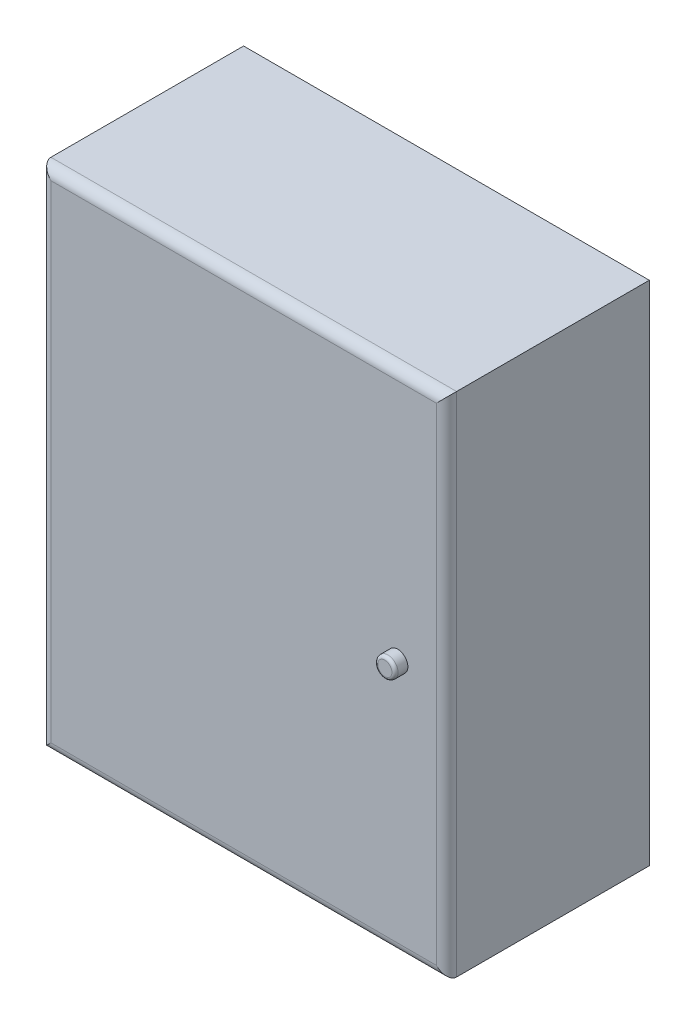
ISO-10303-21;
HEADER;
FILE_DESCRIPTION(('STEP AP214'),'2;1');
FILE_NAME('part.step','',(''),(''),'','','');
FILE_SCHEMA(('AUTOMOTIVE_DESIGN { 1 0 10303 214 1 1 1 1 }'));
ENDSEC;
DATA;
#1=APPLICATION_CONTEXT('core data for automotive mechanical design processes');
#2=APPLICATION_PROTOCOL_DEFINITION('international standard','automotive_design',2000,#1);
#3=PRODUCT_CONTEXT('',#1,'mechanical');
#4=PRODUCT('Part','Part','',(#3));
#5=PRODUCT_RELATED_PRODUCT_CATEGORY('part','',(#4));
#6=PRODUCT_DEFINITION_FORMATION('','',#4);
#7=PRODUCT_DEFINITION_CONTEXT('part definition',#1,'design');
#8=PRODUCT_DEFINITION('design','',#6,#7);
#9=PRODUCT_DEFINITION_SHAPE('','',#8);
#10=(LENGTH_UNIT() NAMED_UNIT(*) SI_UNIT(.MILLI.,.METRE.));
#11=(NAMED_UNIT(*) PLANE_ANGLE_UNIT() SI_UNIT($,.RADIAN.));
#12=(NAMED_UNIT(*) SI_UNIT($,.STERADIAN.) SOLID_ANGLE_UNIT());
#13=UNCERTAINTY_MEASURE_WITH_UNIT(LENGTH_MEASURE(1.E-05),#10,'distance_accuracy_value','');
#14=(GEOMETRIC_REPRESENTATION_CONTEXT(3) GLOBAL_UNCERTAINTY_ASSIGNED_CONTEXT((#13)) GLOBAL_UNIT_ASSIGNED_CONTEXT((#10,
#11,#12)) REPRESENTATION_CONTEXT('',''));
#15=CARTESIAN_POINT('',(0.,0.,0.));
#16=DIRECTION('',(0.,0.,1.));
#17=DIRECTION('',(1.,0.,0.));
#18=AXIS2_PLACEMENT_3D('',#15,#16,#17);
#19=CARTESIAN_POINT('',(0.,0.,200.));
#20=DIRECTION('',(1.,0.,0.));
#21=DIRECTION('',(0.,0.,-1.));
#22=AXIS2_PLACEMENT_3D('',#19,#20,#21);
#23=PLANE('',#22);
#24=DIRECTION('',(0.,0.,-1.));
#25=VECTOR('',#24,1.);
#26=CARTESIAN_POINT('',(0.,0.,200.));
#27=LINE('',#26,#25);
#28=CARTESIAN_POINT('',(0.,0.,190.));
#29=VERTEX_POINT('',#28);
#30=CARTESIAN_POINT('',(0.,0.,0.));
#31=VERTEX_POINT('',#30);
#32=EDGE_CURVE('E84',#29,#31,#27,.T.);
#33=ORIENTED_EDGE('',*,*,#32,.F.);
#34=DIRECTION('',(0.,-1.,0.));
#35=VECTOR('',#34,1.);
#36=CARTESIAN_POINT('',(0.,0.,190.));
#37=LINE('',#36,#35);
#38=CARTESIAN_POINT('',(0.,500.,190.));
#39=VERTEX_POINT('',#38);
#40=EDGE_CURVE('E47',#29,#39,#37,.F.);
#41=ORIENTED_EDGE('',*,*,#40,.T.);
#42=DIRECTION('',(0.,0.,-1.));
#43=VECTOR('',#42,1.);
#44=CARTESIAN_POINT('',(0.,500.,200.));
#45=LINE('',#44,#43);
#46=CARTESIAN_POINT('',(0.,500.,0.));
#47=VERTEX_POINT('',#46);
#48=EDGE_CURVE('E101',#39,#47,#45,.T.);
#49=ORIENTED_EDGE('',*,*,#48,.T.);
#50=DIRECTION('',(0.,-1.,0.));
#51=VECTOR('',#50,1.);
#52=CARTESIAN_POINT('',(0.,0.,0.));
#53=LINE('',#52,#51);
#54=EDGE_CURVE('E97',#47,#31,#53,.T.);
#55=ORIENTED_EDGE('',*,*,#54,.T.);
#56=EDGE_LOOP('',(#33,#41,#49,#55));
#57=FACE_BOUND('',#56,.T.);
#58=ADVANCED_FACE('F32',(#57),#23,.F.);
#59=CARTESIAN_POINT('',(0.,0.,200.));
#60=DIRECTION('',(0.,1.,0.));
#61=DIRECTION('',(0.,0.,1.));
#62=AXIS2_PLACEMENT_3D('',#59,#60,#61);
#63=PLANE('',#62);
#64=DIRECTION('',(0.,0.,-1.));
#65=VECTOR('',#64,1.);
#66=CARTESIAN_POINT('',(400.,0.,200.));
#67=LINE('',#66,#65);
#68=CARTESIAN_POINT('',(400.,0.,190.));
#69=VERTEX_POINT('',#68);
#70=CARTESIAN_POINT('',(400.,0.,0.));
#71=VERTEX_POINT('',#70);
#72=EDGE_CURVE('E91',#69,#71,#67,.T.);
#73=ORIENTED_EDGE('',*,*,#72,.F.);
#74=DIRECTION('',(1.,0.,0.));
#75=VECTOR('',#74,1.);
#76=CARTESIAN_POINT('',(0.,0.,190.));
#77=LINE('',#76,#75);
#78=EDGE_CURVE('E55',#69,#29,#77,.F.);
#79=ORIENTED_EDGE('',*,*,#78,.T.);
#80=ORIENTED_EDGE('',*,*,#32,.T.);
#81=DIRECTION('',(1.,0.,0.));
#82=VECTOR('',#81,1.);
#83=CARTESIAN_POINT('',(0.,0.,0.));
#84=LINE('',#83,#82);
#85=EDGE_CURVE('E87',#31,#71,#84,.T.);
#86=ORIENTED_EDGE('',*,*,#85,.T.);
#87=EDGE_LOOP('',(#73,#79,#80,#86));
#88=FACE_BOUND('',#87,.T.);
#89=ADVANCED_FACE('F86',(#88),#63,.F.);
#90=CARTESIAN_POINT('',(400.,0.,200.));
#91=DIRECTION('',(-1.,0.,0.));
#92=DIRECTION('',(0.,0.,1.));
#93=AXIS2_PLACEMENT_3D('',#90,#91,#92);
#94=PLANE('',#93);
#95=DIRECTION('',(0.,0.,-1.));
#96=VECTOR('',#95,1.);
#97=CARTESIAN_POINT('',(400.,500.,200.));
#98=LINE('',#97,#96);
#99=CARTESIAN_POINT('',(400.,500.,190.));
#100=VERTEX_POINT('',#99);
#101=CARTESIAN_POINT('',(400.,500.,0.));
#102=VERTEX_POINT('',#101);
#103=EDGE_CURVE('E113',#100,#102,#98,.T.);
#104=ORIENTED_EDGE('',*,*,#103,.F.);
#105=DIRECTION('',(0.,1.,0.));
#106=VECTOR('',#105,1.);
#107=CARTESIAN_POINT('',(400.,0.,190.));
#108=LINE('',#107,#106);
#109=EDGE_CURVE('E124',#100,#69,#108,.F.);
#110=ORIENTED_EDGE('',*,*,#109,.T.);
#111=ORIENTED_EDGE('',*,*,#72,.T.);
#112=DIRECTION('',(0.,1.,0.));
#113=VECTOR('',#112,1.);
#114=CARTESIAN_POINT('',(400.,0.,0.));
#115=LINE('',#114,#113);
#116=EDGE_CURVE('E99',#71,#102,#115,.T.);
#117=ORIENTED_EDGE('',*,*,#116,.T.);
#118=EDGE_LOOP('',(#104,#110,#111,#117));
#119=FACE_BOUND('',#118,.T.);
#120=ADVANCED_FACE('F157',(#119),#94,.F.);
#121=CARTESIAN_POINT('',(0.,500.,200.));
#122=DIRECTION('',(0.,-1.,0.));
#123=DIRECTION('',(0.,0.,-1.));
#124=AXIS2_PLACEMENT_3D('',#121,#122,#123);
#125=PLANE('',#124);
#126=ORIENTED_EDGE('',*,*,#48,.F.);
#127=DIRECTION('',(-1.,0.,0.));
#128=VECTOR('',#127,1.);
#129=CARTESIAN_POINT('',(0.,500.,190.));
#130=LINE('',#129,#128);
#131=EDGE_CURVE('E129',#39,#100,#130,.F.);
#132=ORIENTED_EDGE('',*,*,#131,.T.);
#133=ORIENTED_EDGE('',*,*,#103,.T.);
#134=DIRECTION('',(-1.,0.,0.));
#135=VECTOR('',#134,1.);
#136=CARTESIAN_POINT('',(0.,500.,0.));
#137=LINE('',#136,#135);
#138=EDGE_CURVE('E110',#102,#47,#137,.T.);
#139=ORIENTED_EDGE('',*,*,#138,.T.);
#140=EDGE_LOOP('',(#126,#132,#133,#139));
#141=FACE_BOUND('',#140,.T.);
#142=ADVANCED_FACE('F188',(#141),#125,.F.);
#143=CARTESIAN_POINT('',(0.,0.,200.));
#144=DIRECTION('',(0.,0.,-1.));
#145=DIRECTION('',(-1.,0.,0.));
#146=AXIS2_PLACEMENT_3D('',#143,#144,#145);
#147=PLANE('',#146);
#148=CARTESIAN_POINT('',(351.956210026515,250.916140828735,200.));
#149=DIRECTION('',(0.,0.,-1.));
#150=DIRECTION('',(-1.,0.,0.));
#151=AXIS2_PLACEMENT_3D('',#148,#149,#150);
#152=CIRCLE('',#151,9.99999999999998);
#153=CARTESIAN_POINT('',(341.956210026515,250.916140828735,200.));
#154=VERTEX_POINT('',#153);
#155=EDGE_CURVE('E131',#154,#154,#152,.F.);
#156=ORIENTED_EDGE('',*,*,#155,.F.);
#157=EDGE_LOOP('',(#156));
#158=FACE_BOUND('',#157,.T.);
#159=DIRECTION('',(1.,0.,0.));
#160=VECTOR('',#159,1.);
#161=CARTESIAN_POINT('',(0.,10.,200.));
#162=LINE('',#161,#160);
#163=CARTESIAN_POINT('',(10.,10.,200.));
#164=VERTEX_POINT('',#163);
#165=CARTESIAN_POINT('',(390.,10.,200.));
#166=VERTEX_POINT('',#165);
#167=EDGE_CURVE('E119',#164,#166,#162,.T.);
#168=ORIENTED_EDGE('',*,*,#167,.T.);
#169=DIRECTION('',(0.,1.,0.));
#170=VECTOR('',#169,1.);
#171=CARTESIAN_POINT('',(390.,0.,200.));
#172=LINE('',#171,#170);
#173=CARTESIAN_POINT('',(390.,490.,200.));
#174=VERTEX_POINT('',#173);
#175=EDGE_CURVE('E121',#166,#174,#172,.T.);
#176=ORIENTED_EDGE('',*,*,#175,.T.);
#177=DIRECTION('',(-1.,0.,0.));
#178=VECTOR('',#177,1.);
#179=CARTESIAN_POINT('',(0.,490.,200.));
#180=LINE('',#179,#178);
#181=CARTESIAN_POINT('',(10.,490.,200.));
#182=VERTEX_POINT('',#181);
#183=EDGE_CURVE('E90',#174,#182,#180,.T.);
#184=ORIENTED_EDGE('',*,*,#183,.T.);
#185=DIRECTION('',(0.,-1.,0.));
#186=VECTOR('',#185,1.);
#187=CARTESIAN_POINT('',(10.,0.,200.));
#188=LINE('',#187,#186);
#189=EDGE_CURVE('E117',#182,#164,#188,.T.);
#190=ORIENTED_EDGE('',*,*,#189,.T.);
#191=EDGE_LOOP('',(#168,#176,#184,#190));
#192=FACE_BOUND('',#191,.T.);
#193=ADVANCED_FACE('F178',(#158,#192),#147,.F.);
#194=CARTESIAN_POINT('',(0.,0.,0.));
#195=DIRECTION('',(0.,0.,-1.));
#196=DIRECTION('',(-1.,0.,0.));
#197=AXIS2_PLACEMENT_3D('',#194,#195,#196);
#198=PLANE('',#197);
#199=ORIENTED_EDGE('',*,*,#54,.F.);
#200=ORIENTED_EDGE('',*,*,#138,.F.);
#201=ORIENTED_EDGE('',*,*,#116,.F.);
#202=ORIENTED_EDGE('',*,*,#85,.F.);
#203=EDGE_LOOP('',(#199,#200,#201,#202));
#204=FACE_BOUND('',#203,.T.);
#205=ADVANCED_FACE('F95',(#204),#198,.T.);
#206=CARTESIAN_POINT('',(10.,0.,190.));
#207=DIRECTION('',(0.,-1.,0.));
#208=DIRECTION('',(0.,0.,-1.));
#209=AXIS2_PLACEMENT_3D('',#206,#207,#208);
#210=CYLINDRICAL_SURFACE('',#209,10.);
#211=CARTESIAN_POINT('',(10.,490.,190.));
#212=DIRECTION('',(-0.707106781186547,-0.707106781186547,0.));
#213=DIRECTION('',(-0.707106781186547,0.707106781186547,0.));
#214=AXIS2_PLACEMENT_3D('',#211,#212,#213);
#215=ELLIPSE('',#214,14.1421356237309,10.);
#216=EDGE_CURVE('E106',#39,#182,#215,.F.);
#217=ORIENTED_EDGE('',*,*,#216,.F.);
#218=ORIENTED_EDGE('',*,*,#40,.F.);
#219=CARTESIAN_POINT('',(10.,10.,190.));
#220=DIRECTION('',(0.707106781186547,-0.707106781186547,0.));
#221=DIRECTION('',(-0.707106781186547,-0.707106781186547,0.));
#222=AXIS2_PLACEMENT_3D('',#219,#220,#221);
#223=ELLIPSE('',#222,14.1421356237309,10.);
#224=EDGE_CURVE('E103',#164,#29,#223,.T.);
#225=ORIENTED_EDGE('',*,*,#224,.F.);
#226=ORIENTED_EDGE('',*,*,#189,.F.);
#227=EDGE_LOOP('',(#217,#218,#225,#226));
#228=FACE_BOUND('',#227,.T.);
#229=ADVANCED_FACE('F171',(#228),#210,.T.);
#230=CARTESIAN_POINT('',(0.,10.,190.));
#231=DIRECTION('',(1.,0.,0.));
#232=DIRECTION('',(0.,0.,-1.));
#233=AXIS2_PLACEMENT_3D('',#230,#231,#232);
#234=CYLINDRICAL_SURFACE('',#233,10.);
#235=ORIENTED_EDGE('',*,*,#224,.T.);
#236=ORIENTED_EDGE('',*,*,#78,.F.);
#237=CARTESIAN_POINT('',(390.,10.,190.));
#238=DIRECTION('',(0.707106781186547,0.707106781186547,0.));
#239=DIRECTION('',(0.707106781186547,-0.707106781186547,0.));
#240=AXIS2_PLACEMENT_3D('',#237,#238,#239);
#241=ELLIPSE('',#240,14.1421356237309,10.);
#242=EDGE_CURVE('E134',#166,#69,#241,.T.);
#243=ORIENTED_EDGE('',*,*,#242,.F.);
#244=ORIENTED_EDGE('',*,*,#167,.F.);
#245=EDGE_LOOP('',(#235,#236,#243,#244));
#246=FACE_BOUND('',#245,.T.);
#247=ADVANCED_FACE('F168',(#246),#234,.T.);
#248=CARTESIAN_POINT('',(0.,490.,190.));
#249=DIRECTION('',(-1.,0.,0.));
#250=DIRECTION('',(0.,0.,1.));
#251=AXIS2_PLACEMENT_3D('',#248,#249,#250);
#252=CYLINDRICAL_SURFACE('',#251,10.);
#253=ORIENTED_EDGE('',*,*,#216,.T.);
#254=ORIENTED_EDGE('',*,*,#183,.F.);
#255=CARTESIAN_POINT('',(390.,490.,190.));
#256=DIRECTION('',(-0.707106781186547,0.707106781186547,0.));
#257=DIRECTION('',(-0.707106781186547,-0.707106781186547,0.));
#258=AXIS2_PLACEMENT_3D('',#255,#256,#257);
#259=ELLIPSE('',#258,14.1421356237309,10.);
#260=EDGE_CURVE('E132',#100,#174,#259,.F.);
#261=ORIENTED_EDGE('',*,*,#260,.F.);
#262=ORIENTED_EDGE('',*,*,#131,.F.);
#263=EDGE_LOOP('',(#253,#254,#261,#262));
#264=FACE_BOUND('',#263,.T.);
#265=ADVANCED_FACE('F164',(#264),#252,.T.);
#266=CARTESIAN_POINT('',(390.,0.,190.));
#267=DIRECTION('',(0.,1.,0.));
#268=DIRECTION('',(0.,0.,1.));
#269=AXIS2_PLACEMENT_3D('',#266,#267,#268);
#270=CYLINDRICAL_SURFACE('',#269,10.);
#271=ORIENTED_EDGE('',*,*,#242,.T.);
#272=ORIENTED_EDGE('',*,*,#109,.F.);
#273=ORIENTED_EDGE('',*,*,#260,.T.);
#274=ORIENTED_EDGE('',*,*,#175,.F.);
#275=EDGE_LOOP('',(#271,#272,#273,#274));
#276=FACE_BOUND('',#275,.T.);
#277=ADVANCED_FACE('F161',(#276),#270,.T.);
#278=CARTESIAN_POINT('',(351.956210026515,250.916140828735,212.7));
#279=DIRECTION('',(0.,0.,-1.));
#280=DIRECTION('',(-1.,0.,0.));
#281=AXIS2_PLACEMENT_3D('',#278,#279,#280);
#282=CYLINDRICAL_SURFACE('',#281,9.99999999999998);
#283=CARTESIAN_POINT('',(351.956210026515,250.916140828735,209.7));
#284=DIRECTION('',(0.,0.,1.));
#285=DIRECTION('',(1.,0.,0.));
#286=AXIS2_PLACEMENT_3D('',#283,#284,#285);
#287=CIRCLE('',#286,9.99999999999998);
#288=CARTESIAN_POINT('',(361.956210026515,250.916140828735,209.7));
#289=VERTEX_POINT('',#288);
#290=EDGE_CURVE('E11',#289,#289,#287,.F.);
#291=ORIENTED_EDGE('',*,*,#290,.T.);
#292=EDGE_LOOP('',(#291));
#293=FACE_BOUND('',#292,.T.);
#294=ORIENTED_EDGE('',*,*,#155,.T.);
#295=EDGE_LOOP('',(#294));
#296=FACE_BOUND('',#295,.T.);
#297=ADVANCED_FACE('F149',(#293,#296),#282,.T.);
#298=CARTESIAN_POINT('',(351.956210026515,250.916140828735,212.7));
#299=DIRECTION('',(0.,0.,1.));
#300=DIRECTION('',(1.,0.,0.));
#301=AXIS2_PLACEMENT_3D('',#298,#299,#300);
#302=PLANE('',#301);
#303=CARTESIAN_POINT('',(351.956210026515,250.916140828735,212.7));
#304=DIRECTION('',(0.,0.,1.));
#305=DIRECTION('',(1.,0.,0.));
#306=AXIS2_PLACEMENT_3D('',#303,#304,#305);
#307=CIRCLE('',#306,6.99999999999998);
#308=CARTESIAN_POINT('',(358.956210026515,250.916140828735,212.7));
#309=VERTEX_POINT('',#308);
#310=EDGE_CURVE('E40',#309,#309,#307,.T.);
#311=ORIENTED_EDGE('',*,*,#310,.T.);
#312=EDGE_LOOP('',(#311));
#313=FACE_BOUND('',#312,.T.);
#314=ADVANCED_FACE('F142',(#313),#302,.T.);
#315=CARTESIAN_POINT('',(351.956210026515,250.916140828735,209.7));
#316=DIRECTION('',(0.,0.,1.));
#317=DIRECTION('',(1.,0.,0.));
#318=AXIS2_PLACEMENT_3D('',#315,#316,#317);
#319=TOROIDAL_SURFACE('',#318,6.99999999999998,3.);
#320=ORIENTED_EDGE('',*,*,#290,.F.);
#321=EDGE_LOOP('',(#320));
#322=FACE_BOUND('',#321,.T.);
#323=ORIENTED_EDGE('',*,*,#310,.F.);
#324=EDGE_LOOP('',(#323));
#325=FACE_BOUND('',#324,.T.);
#326=ADVANCED_FACE('F34',(#322,#325),#319,.T.);
#327=CLOSED_SHELL('',(#58,#89,#120,#142,#193,#205,#229,#247,#265,#277,#297,#314,#326));
#328=MANIFOLD_SOLID_BREP('B2',#327);
#329=ADVANCED_BREP_SHAPE_REPRESENTATION('',(#18,#328),#14);
#330=SHAPE_DEFINITION_REPRESENTATION(#9,#329);
ENDSEC;
END-ISO-10303-21;
